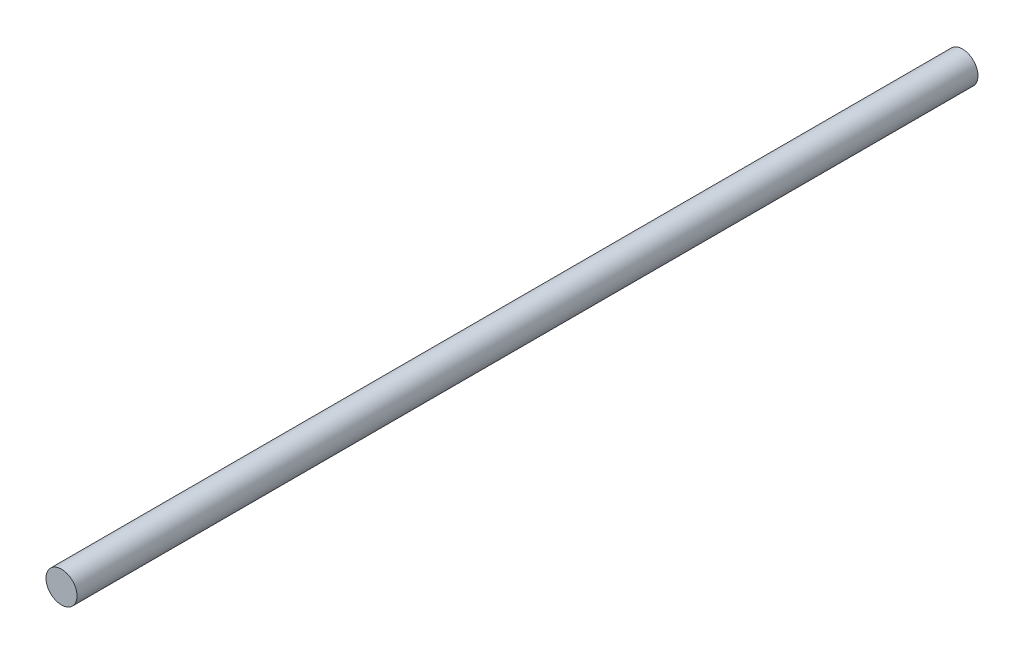
ISO-10303-21;
HEADER;
FILE_DESCRIPTION(('STEP AP214'),'2;1');
FILE_NAME('part.step','',(''),(''),'','','');
FILE_SCHEMA(('AUTOMOTIVE_DESIGN { 1 0 10303 214 1 1 1 1 }'));
ENDSEC;
DATA;
#1=APPLICATION_CONTEXT('core data for automotive mechanical design processes');
#2=APPLICATION_PROTOCOL_DEFINITION('international standard','automotive_design',2000,#1);
#3=PRODUCT_CONTEXT('',#1,'mechanical');
#4=PRODUCT('Part','Part','',(#3));
#5=PRODUCT_RELATED_PRODUCT_CATEGORY('part','',(#4));
#6=PRODUCT_DEFINITION_FORMATION('','',#4);
#7=PRODUCT_DEFINITION_CONTEXT('part definition',#1,'design');
#8=PRODUCT_DEFINITION('design','',#6,#7);
#9=PRODUCT_DEFINITION_SHAPE('','',#8);
#10=(LENGTH_UNIT() NAMED_UNIT(*) SI_UNIT(.MILLI.,.METRE.));
#11=(NAMED_UNIT(*) PLANE_ANGLE_UNIT() SI_UNIT($,.RADIAN.));
#12=(NAMED_UNIT(*) SI_UNIT($,.STERADIAN.) SOLID_ANGLE_UNIT());
#13=UNCERTAINTY_MEASURE_WITH_UNIT(LENGTH_MEASURE(1.E-05),#10,'distance_accuracy_value','');
#14=(GEOMETRIC_REPRESENTATION_CONTEXT(3) GLOBAL_UNCERTAINTY_ASSIGNED_CONTEXT((#13)) GLOBAL_UNIT_ASSIGNED_CONTEXT((#10,
#11,#12)) REPRESENTATION_CONTEXT('',''));
#15=CARTESIAN_POINT('',(0.,0.,0.));
#16=DIRECTION('',(0.,0.,1.));
#17=DIRECTION('',(1.,0.,0.));
#18=AXIS2_PLACEMENT_3D('',#15,#16,#17);
#19=CARTESIAN_POINT('',(0.,0.,290.));
#20=DIRECTION('',(0.,0.,-1.));
#21=DIRECTION('',(-1.,0.,0.));
#22=AXIS2_PLACEMENT_3D('',#19,#20,#21);
#23=CYLINDRICAL_SURFACE('',#22,5.);
#24=CARTESIAN_POINT('',(0.,0.,290.));
#25=DIRECTION('',(0.,0.,1.));
#26=DIRECTION('',(1.,0.,0.));
#27=AXIS2_PLACEMENT_3D('',#24,#25,#26);
#28=CIRCLE('',#27,5.);
#29=CARTESIAN_POINT('',(5.,0.,290.));
#30=VERTEX_POINT('',#29);
#31=EDGE_CURVE('E10',#30,#30,#28,.T.);
#32=ORIENTED_EDGE('',*,*,#31,.F.);
#33=EDGE_LOOP('',(#32));
#34=FACE_BOUND('',#33,.T.);
#35=CARTESIAN_POINT('',(0.,0.,0.));
#36=DIRECTION('',(0.,0.,1.));
#37=DIRECTION('',(1.,0.,0.));
#38=AXIS2_PLACEMENT_3D('',#35,#36,#37);
#39=CIRCLE('',#38,5.);
#40=CARTESIAN_POINT('',(5.,0.,0.));
#41=VERTEX_POINT('',#40);
#42=EDGE_CURVE('E41',#41,#41,#39,.T.);
#43=ORIENTED_EDGE('',*,*,#42,.T.);
#44=EDGE_LOOP('',(#43));
#45=FACE_BOUND('',#44,.T.);
#46=ADVANCED_FACE('F38',(#34,#45),#23,.T.);
#47=CARTESIAN_POINT('',(0.,0.,290.));
#48=DIRECTION('',(0.,0.,1.));
#49=DIRECTION('',(1.,0.,0.));
#50=AXIS2_PLACEMENT_3D('',#47,#48,#49);
#51=PLANE('',#50);
#52=ORIENTED_EDGE('',*,*,#31,.T.);
#53=EDGE_LOOP('',(#52));
#54=FACE_BOUND('',#53,.T.);
#55=ADVANCED_FACE('F53',(#54),#51,.T.);
#56=CARTESIAN_POINT('',(0.,0.,0.));
#57=DIRECTION('',(0.,0.,1.));
#58=DIRECTION('',(1.,0.,0.));
#59=AXIS2_PLACEMENT_3D('',#56,#57,#58);
#60=PLANE('',#59);
#61=ORIENTED_EDGE('',*,*,#42,.F.);
#62=EDGE_LOOP('',(#61));
#63=FACE_BOUND('',#62,.T.);
#64=ADVANCED_FACE('F51',(#63),#60,.F.);
#65=CLOSED_SHELL('',(#46,#55,#64));
#66=MANIFOLD_SOLID_BREP('B2',#65);
#67=ADVANCED_BREP_SHAPE_REPRESENTATION('',(#18,#66),#14);
#68=SHAPE_DEFINITION_REPRESENTATION(#9,#67);
ENDSEC;
END-ISO-10303-21;
